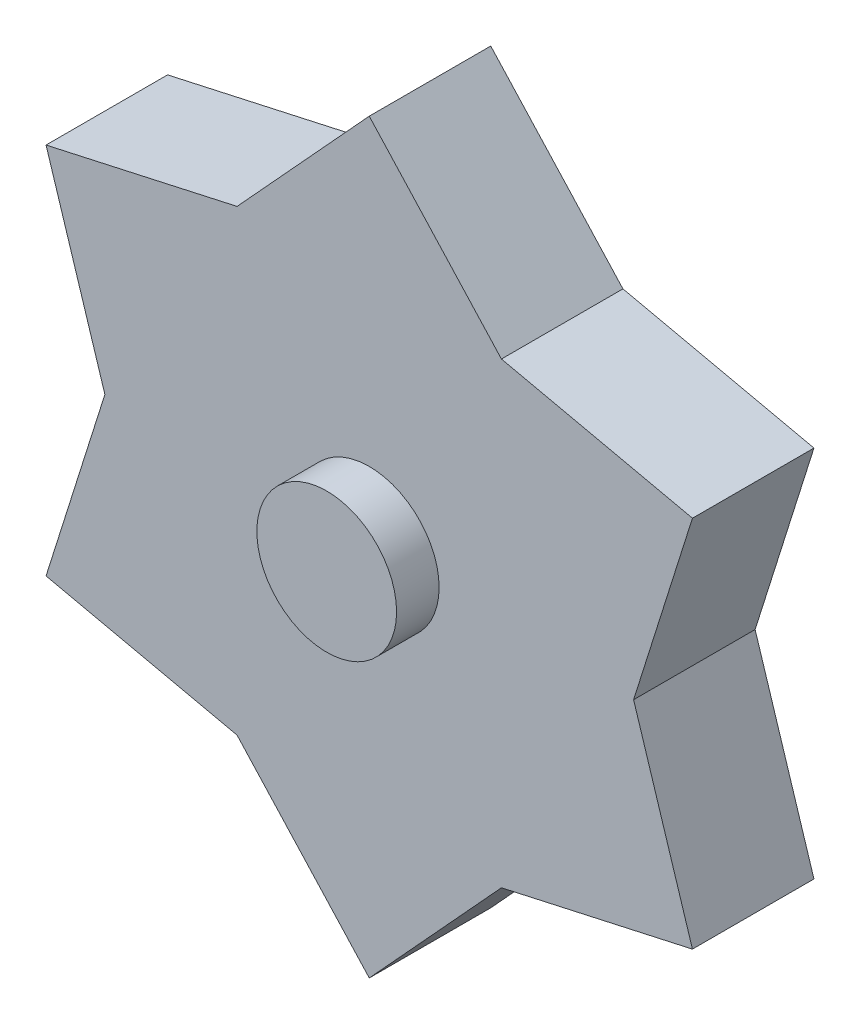
ISO-10303-21;
HEADER;
FILE_DESCRIPTION(('STEP AP214'),'2;1');
FILE_NAME('part.step','',(''),(''),'','','');
FILE_SCHEMA(('AUTOMOTIVE_DESIGN { 1 0 10303 214 1 1 1 1 }'));
ENDSEC;
DATA;
#1=APPLICATION_CONTEXT('core data for automotive mechanical design processes');
#2=APPLICATION_PROTOCOL_DEFINITION('international standard','automotive_design',2000,#1);
#3=PRODUCT_CONTEXT('',#1,'mechanical');
#4=PRODUCT('Part','Part','',(#3));
#5=PRODUCT_RELATED_PRODUCT_CATEGORY('part','',(#4));
#6=PRODUCT_DEFINITION_FORMATION('','',#4);
#7=PRODUCT_DEFINITION_CONTEXT('part definition',#1,'design');
#8=PRODUCT_DEFINITION('design','',#6,#7);
#9=PRODUCT_DEFINITION_SHAPE('','',#8);
#10=(LENGTH_UNIT() NAMED_UNIT(*) SI_UNIT(.MILLI.,.METRE.));
#11=(NAMED_UNIT(*) PLANE_ANGLE_UNIT() SI_UNIT($,.RADIAN.));
#12=(NAMED_UNIT(*) SI_UNIT($,.STERADIAN.) SOLID_ANGLE_UNIT());
#13=UNCERTAINTY_MEASURE_WITH_UNIT(LENGTH_MEASURE(1.E-05),#10,'distance_accuracy_value','');
#14=(GEOMETRIC_REPRESENTATION_CONTEXT(3) GLOBAL_UNCERTAINTY_ASSIGNED_CONTEXT((#13)) GLOBAL_UNIT_ASSIGNED_CONTEXT((#10,
#11,#12)) REPRESENTATION_CONTEXT('',''));
#15=CARTESIAN_POINT('',(0.,0.,0.));
#16=DIRECTION('',(0.,0.,1.));
#17=DIRECTION('',(1.,0.,0.));
#18=AXIS2_PLACEMENT_3D('',#15,#16,#17);
#19=CARTESIAN_POINT('',(3.95792534560514,1.24792906794276,-2.));
#20=DIRECTION('',(-0.953716950748225,-0.300705799504278,0.));
#21=DIRECTION('',(0.300705799504278,-0.953716950748225,0.));
#22=AXIS2_PLACEMENT_3D('',#19,#20,#21);
#23=PLANE('',#22);
#24=DIRECTION('',(0.300705799504278,-0.953716950748225,0.));
#25=VECTOR('',#24,1.);
#26=CARTESIAN_POINT('',(3.95792534560514,1.24792906794276,0.));
#27=LINE('',#26,#25);
#28=CARTESIAN_POINT('',(4.35139586933438,0.,0.));
#29=VERTEX_POINT('',#28);
#30=CARTESIAN_POINT('',(5.31980094618253,-3.07138850831371,0.));
#31=VERTEX_POINT('',#30);
#32=EDGE_CURVE('E211',#29,#31,#27,.T.);
#33=ORIENTED_EDGE('',*,*,#32,.T.);
#34=DIRECTION('',(0.,0.,1.));
#35=VECTOR('',#34,1.);
#36=CARTESIAN_POINT('',(5.31980094618253,-3.07138850831371,-2.));
#37=LINE('',#36,#35);
#38=CARTESIAN_POINT('',(5.31980094618253,-3.07138850831371,-2.));
#39=VERTEX_POINT('',#38);
#40=EDGE_CURVE('E12',#39,#31,#37,.T.);
#41=ORIENTED_EDGE('',*,*,#40,.F.);
#42=DIRECTION('',(0.300705799504278,-0.953716950748225,0.));
#43=VECTOR('',#42,1.);
#44=CARTESIAN_POINT('',(3.95792534560514,1.24792906794276,-2.));
#45=LINE('',#44,#43);
#46=CARTESIAN_POINT('',(4.35139586933438,0.,-2.));
#47=VERTEX_POINT('',#46);
#48=EDGE_CURVE('E246',#47,#39,#45,.T.);
#49=ORIENTED_EDGE('',*,*,#48,.F.);
#50=DIRECTION('',(0.,0.,1.));
#51=VECTOR('',#50,1.);
#52=CARTESIAN_POINT('',(4.35139586933438,0.,-2.));
#53=LINE('',#52,#51);
#54=EDGE_CURVE('E89',#47,#29,#53,.T.);
#55=ORIENTED_EDGE('',*,*,#54,.T.);
#56=EDGE_LOOP('',(#33,#41,#49,#55));
#57=FACE_BOUND('',#56,.T.);
#58=ADVANCED_FACE('F86',(#57),#23,.F.);
#59=CARTESIAN_POINT('',(0.898224397843139,-4.05162842954775,-2.));
#60=DIRECTION('',(-0.216439613938104,0.976296007119933,0.));
#61=DIRECTION('',(-0.976296007119933,-0.216439613938104,0.));
#62=AXIS2_PLACEMENT_3D('',#59,#60,#61);
#63=PLANE('',#62);
#64=DIRECTION('',(-0.976296007119933,-0.216439613938104,0.));
#65=VECTOR('',#64,1.);
#66=CARTESIAN_POINT('',(0.898224397843139,-4.05162842954775,0.));
#67=LINE('',#66,#65);
#68=CARTESIAN_POINT('',(2.17569793466716,-3.76841936476627,0.));
#69=VERTEX_POINT('',#68);
#70=EDGE_CURVE('E142',#31,#69,#67,.T.);
#71=ORIENTED_EDGE('',*,*,#70,.T.);
#72=DIRECTION('',(0.,0.,1.));
#73=VECTOR('',#72,1.);
#74=CARTESIAN_POINT('',(2.17569793466716,-3.76841936476627,-2.));
#75=LINE('',#74,#73);
#76=CARTESIAN_POINT('',(2.17569793466716,-3.76841936476627,-2.));
#77=VERTEX_POINT('',#76);
#78=EDGE_CURVE('E96',#77,#69,#75,.T.);
#79=ORIENTED_EDGE('',*,*,#78,.F.);
#80=DIRECTION('',(-0.976296007119933,-0.216439613938104,0.));
#81=VECTOR('',#80,1.);
#82=CARTESIAN_POINT('',(0.898224397843139,-4.05162842954775,-2.));
#83=LINE('',#82,#81);
#84=EDGE_CURVE('E104',#39,#77,#83,.T.);
#85=ORIENTED_EDGE('',*,*,#84,.F.);
#86=ORIENTED_EDGE('',*,*,#40,.T.);
#87=EDGE_LOOP('',(#71,#79,#85,#86));
#88=FACE_BOUND('',#87,.T.);
#89=ADVANCED_FACE('F301',(#88),#63,.F.);
#90=CARTESIAN_POINT('',(3.05970094776203,-2.80369936160497,-2.));
#91=DIRECTION('',(-0.737277336810128,0.675590207615656,0.));
#92=DIRECTION('',(-0.675590207615656,-0.737277336810128,0.));
#93=AXIS2_PLACEMENT_3D('',#90,#91,#92);
#94=PLANE('',#93);
#95=DIRECTION('',(-0.675590207615656,-0.737277336810128,0.));
#96=VECTOR('',#95,1.);
#97=CARTESIAN_POINT('',(3.05970094776203,-2.80369936160497,0.));
#98=LINE('',#97,#96);
#99=CARTESIAN_POINT('',(0.,-6.14277701662742,0.));
#100=VERTEX_POINT('',#99);
#101=EDGE_CURVE('E192',#69,#100,#98,.T.);
#102=ORIENTED_EDGE('',*,*,#101,.T.);
#103=DIRECTION('',(0.,0.,1.));
#104=VECTOR('',#103,1.);
#105=CARTESIAN_POINT('',(0.,-6.14277701662742,-2.));
#106=LINE('',#105,#104);
#107=CARTESIAN_POINT('',(0.,-6.14277701662742,-2.));
#108=VERTEX_POINT('',#107);
#109=EDGE_CURVE('E190',#108,#100,#106,.T.);
#110=ORIENTED_EDGE('',*,*,#109,.F.);
#111=DIRECTION('',(-0.675590207615656,-0.737277336810128,0.));
#112=VECTOR('',#111,1.);
#113=CARTESIAN_POINT('',(3.05970094776203,-2.80369936160497,-2.));
#114=LINE('',#113,#112);
#115=EDGE_CURVE('E180',#77,#108,#114,.T.);
#116=ORIENTED_EDGE('',*,*,#115,.F.);
#117=ORIENTED_EDGE('',*,*,#78,.T.);
#118=EDGE_LOOP('',(#102,#110,#116,#117));
#119=FACE_BOUND('',#118,.T.);
#120=ADVANCED_FACE('F191',(#119),#94,.F.);
#121=CARTESIAN_POINT('',(-3.05970094776203,-2.80369936160502,-2.));
#122=DIRECTION('',(0.737277336810123,0.675590207615661,0.));
#123=DIRECTION('',(-0.675590207615661,0.737277336810123,0.));
#124=AXIS2_PLACEMENT_3D('',#121,#122,#123);
#125=PLANE('',#124);
#126=DIRECTION('',(-0.675590207615661,0.737277336810123,0.));
#127=VECTOR('',#126,1.);
#128=CARTESIAN_POINT('',(-3.05970094776203,-2.80369936160502,0.));
#129=LINE('',#128,#127);
#130=CARTESIAN_POINT('',(-2.17569793466723,-3.76841936476623,0.));
#131=VERTEX_POINT('',#130);
#132=EDGE_CURVE('E240',#100,#131,#129,.T.);
#133=ORIENTED_EDGE('',*,*,#132,.T.);
#134=DIRECTION('',(0.,0.,1.));
#135=VECTOR('',#134,1.);
#136=CARTESIAN_POINT('',(-2.17569793466723,-3.76841936476623,-2.));
#137=LINE('',#136,#135);
#138=CARTESIAN_POINT('',(-2.17569793466723,-3.76841936476623,-2.));
#139=VERTEX_POINT('',#138);
#140=EDGE_CURVE('E196',#139,#131,#137,.T.);
#141=ORIENTED_EDGE('',*,*,#140,.F.);
#142=DIRECTION('',(-0.675590207615661,0.737277336810123,0.));
#143=VECTOR('',#142,1.);
#144=CARTESIAN_POINT('',(-3.05970094776203,-2.80369936160502,-2.));
#145=LINE('',#144,#143);
#146=EDGE_CURVE('E184',#108,#139,#145,.T.);
#147=ORIENTED_EDGE('',*,*,#146,.F.);
#148=ORIENTED_EDGE('',*,*,#109,.T.);
#149=EDGE_LOOP('',(#133,#141,#147,#148));
#150=FACE_BOUND('',#149,.T.);
#151=ADVANCED_FACE('F198',(#150),#125,.F.);
#152=CARTESIAN_POINT('',(-0.898224397843104,-4.05162842954773,-2.));
#153=DIRECTION('',(0.216439613938097,0.976296007119935,0.));
#154=DIRECTION('',(-0.976296007119935,0.216439613938097,0.));
#155=AXIS2_PLACEMENT_3D('',#152,#153,#154);
#156=PLANE('',#155);
#157=DIRECTION('',(-0.976296007119935,0.216439613938097,0.));
#158=VECTOR('',#157,1.);
#159=CARTESIAN_POINT('',(-0.898224397843104,-4.05162842954773,0.));
#160=LINE('',#159,#158);
#161=CARTESIAN_POINT('',(-5.31980094618253,-3.07138850831371,0.));
#162=VERTEX_POINT('',#161);
#163=EDGE_CURVE('E237',#131,#162,#160,.T.);
#164=ORIENTED_EDGE('',*,*,#163,.T.);
#165=DIRECTION('',(0.,0.,1.));
#166=VECTOR('',#165,1.);
#167=CARTESIAN_POINT('',(-5.31980094618253,-3.07138850831371,-2.));
#168=LINE('',#167,#166);
#169=CARTESIAN_POINT('',(-5.31980094618253,-3.07138850831371,-2.));
#170=VERTEX_POINT('',#169);
#171=EDGE_CURVE('E252',#170,#162,#168,.T.);
#172=ORIENTED_EDGE('',*,*,#171,.F.);
#173=DIRECTION('',(-0.976296007119935,0.216439613938097,0.));
#174=VECTOR('',#173,1.);
#175=CARTESIAN_POINT('',(-0.898224397843104,-4.05162842954773,-2.));
#176=LINE('',#175,#174);
#177=EDGE_CURVE('E202',#139,#170,#176,.T.);
#178=ORIENTED_EDGE('',*,*,#177,.F.);
#179=ORIENTED_EDGE('',*,*,#140,.T.);
#180=EDGE_LOOP('',(#164,#172,#178,#179));
#181=FACE_BOUND('',#180,.T.);
#182=ADVANCED_FACE('F314',(#181),#156,.F.);
#183=CARTESIAN_POINT('',(-3.95792534560517,1.24792906794274,-2.));
#184=DIRECTION('',(0.953716950748227,-0.300705799504272,0.));
#185=DIRECTION('',(0.300705799504272,0.953716950748228,0.));
#186=AXIS2_PLACEMENT_3D('',#183,#184,#185);
#187=PLANE('',#186);
#188=DIRECTION('',(0.300705799504272,0.953716950748228,0.));
#189=VECTOR('',#188,1.);
#190=CARTESIAN_POINT('',(-3.95792534560517,1.24792906794274,0.));
#191=LINE('',#190,#189);
#192=CARTESIAN_POINT('',(-4.35139586933439,0.,0.));
#193=VERTEX_POINT('',#192);
#194=EDGE_CURVE('E234',#162,#193,#191,.T.);
#195=ORIENTED_EDGE('',*,*,#194,.T.);
#196=DIRECTION('',(0.,0.,1.));
#197=VECTOR('',#196,1.);
#198=CARTESIAN_POINT('',(-4.35139586933439,0.,-2.));
#199=LINE('',#198,#197);
#200=CARTESIAN_POINT('',(-4.35139586933439,0.,-2.));
#201=VERTEX_POINT('',#200);
#202=EDGE_CURVE('E256',#201,#193,#199,.T.);
#203=ORIENTED_EDGE('',*,*,#202,.F.);
#204=DIRECTION('',(0.300705799504272,0.953716950748228,0.));
#205=VECTOR('',#204,1.);
#206=CARTESIAN_POINT('',(-3.95792534560517,1.24792906794274,-2.));
#207=LINE('',#206,#205);
#208=EDGE_CURVE('E205',#170,#201,#207,.T.);
#209=ORIENTED_EDGE('',*,*,#208,.F.);
#210=ORIENTED_EDGE('',*,*,#171,.T.);
#211=EDGE_LOOP('',(#195,#203,#209,#210));
#212=FACE_BOUND('',#211,.T.);
#213=ADVANCED_FACE('F317',(#212),#187,.F.);
#214=CARTESIAN_POINT('',(-3.95792534560514,-1.24792906794276,-2.));
#215=DIRECTION('',(0.953716950748225,0.300705799504279,0.));
#216=DIRECTION('',(-0.300705799504279,0.953716950748225,0.));
#217=AXIS2_PLACEMENT_3D('',#214,#215,#216);
#218=PLANE('',#217);
#219=DIRECTION('',(-0.300705799504279,0.953716950748225,0.));
#220=VECTOR('',#219,1.);
#221=CARTESIAN_POINT('',(-3.95792534560514,-1.24792906794276,0.));
#222=LINE('',#221,#220);
#223=CARTESIAN_POINT('',(-5.31980094618253,3.07138850831371,0.));
#224=VERTEX_POINT('',#223);
#225=EDGE_CURVE('E231',#193,#224,#222,.T.);
#226=ORIENTED_EDGE('',*,*,#225,.T.);
#227=DIRECTION('',(0.,0.,1.));
#228=VECTOR('',#227,1.);
#229=CARTESIAN_POINT('',(-5.31980094618253,3.07138850831371,-2.));
#230=LINE('',#229,#228);
#231=CARTESIAN_POINT('',(-5.31980094618253,3.07138850831371,-2.));
#232=VERTEX_POINT('',#231);
#233=EDGE_CURVE('E260',#232,#224,#230,.T.);
#234=ORIENTED_EDGE('',*,*,#233,.F.);
#235=DIRECTION('',(-0.300705799504279,0.953716950748225,0.));
#236=VECTOR('',#235,1.);
#237=CARTESIAN_POINT('',(-3.95792534560514,-1.24792906794276,-2.));
#238=LINE('',#237,#236);
#239=EDGE_CURVE('E359',#201,#232,#238,.T.);
#240=ORIENTED_EDGE('',*,*,#239,.F.);
#241=ORIENTED_EDGE('',*,*,#202,.T.);
#242=EDGE_LOOP('',(#226,#234,#240,#241));
#243=FACE_BOUND('',#242,.T.);
#244=ADVANCED_FACE('F321',(#243),#218,.F.);
#245=CARTESIAN_POINT('',(-0.898224397843142,4.05162842954775,-2.));
#246=DIRECTION('',(0.216439613938105,-0.976296007119933,0.));
#247=DIRECTION('',(0.976296007119933,0.216439613938105,0.));
#248=AXIS2_PLACEMENT_3D('',#245,#246,#247);
#249=PLANE('',#248);
#250=DIRECTION('',(0.976296007119933,0.216439613938105,0.));
#251=VECTOR('',#250,1.);
#252=CARTESIAN_POINT('',(-0.898224397843142,4.05162842954775,0.));
#253=LINE('',#252,#251);
#254=CARTESIAN_POINT('',(-2.17569793466716,3.76841936476627,0.));
#255=VERTEX_POINT('',#254);
#256=EDGE_CURVE('E228',#224,#255,#253,.T.);
#257=ORIENTED_EDGE('',*,*,#256,.T.);
#258=DIRECTION('',(0.,0.,1.));
#259=VECTOR('',#258,1.);
#260=CARTESIAN_POINT('',(-2.17569793466716,3.76841936476627,-2.));
#261=LINE('',#260,#259);
#262=CARTESIAN_POINT('',(-2.17569793466716,3.76841936476627,-2.));
#263=VERTEX_POINT('',#262);
#264=EDGE_CURVE('E264',#263,#255,#261,.T.);
#265=ORIENTED_EDGE('',*,*,#264,.F.);
#266=DIRECTION('',(0.976296007119933,0.216439613938105,0.));
#267=VECTOR('',#266,1.);
#268=CARTESIAN_POINT('',(-0.898224397843142,4.05162842954775,-2.));
#269=LINE('',#268,#267);
#270=EDGE_CURVE('E356',#232,#263,#269,.T.);
#271=ORIENTED_EDGE('',*,*,#270,.F.);
#272=ORIENTED_EDGE('',*,*,#233,.T.);
#273=EDGE_LOOP('',(#257,#265,#271,#272));
#274=FACE_BOUND('',#273,.T.);
#275=ADVANCED_FACE('F325',(#274),#249,.F.);
#276=CARTESIAN_POINT('',(-3.05970094776203,2.80369936160498,-2.));
#277=DIRECTION('',(0.737277336810128,-0.675590207615656,0.));
#278=DIRECTION('',(0.675590207615656,0.737277336810128,0.));
#279=AXIS2_PLACEMENT_3D('',#276,#277,#278);
#280=PLANE('',#279);
#281=DIRECTION('',(0.675590207615656,0.737277336810128,0.));
#282=VECTOR('',#281,1.);
#283=CARTESIAN_POINT('',(-3.05970094776203,2.80369936160498,0.));
#284=LINE('',#283,#282);
#285=CARTESIAN_POINT('',(0.,6.14277701662742,0.));
#286=VERTEX_POINT('',#285);
#287=EDGE_CURVE('E225',#255,#286,#284,.T.);
#288=ORIENTED_EDGE('',*,*,#287,.T.);
#289=DIRECTION('',(0.,0.,1.));
#290=VECTOR('',#289,1.);
#291=CARTESIAN_POINT('',(0.,6.14277701662742,-2.));
#292=LINE('',#291,#290);
#293=CARTESIAN_POINT('',(0.,6.14277701662742,-2.));
#294=VERTEX_POINT('',#293);
#295=EDGE_CURVE('E268',#294,#286,#292,.T.);
#296=ORIENTED_EDGE('',*,*,#295,.F.);
#297=DIRECTION('',(0.675590207615656,0.737277336810128,0.));
#298=VECTOR('',#297,1.);
#299=CARTESIAN_POINT('',(-3.05970094776203,2.80369936160498,-2.));
#300=LINE('',#299,#298);
#301=EDGE_CURVE('E349',#263,#294,#300,.T.);
#302=ORIENTED_EDGE('',*,*,#301,.F.);
#303=ORIENTED_EDGE('',*,*,#264,.T.);
#304=EDGE_LOOP('',(#288,#296,#302,#303));
#305=FACE_BOUND('',#304,.T.);
#306=ADVANCED_FACE('F329',(#305),#280,.F.);
#307=CARTESIAN_POINT('',(3.05970094776203,2.80369936160501,-2.));
#308=DIRECTION('',(-0.737277336810123,-0.675590207615661,0.));
#309=DIRECTION('',(0.675590207615661,-0.737277336810123,0.));
#310=AXIS2_PLACEMENT_3D('',#307,#308,#309);
#311=PLANE('',#310);
#312=DIRECTION('',(0.675590207615661,-0.737277336810123,0.));
#313=VECTOR('',#312,1.);
#314=CARTESIAN_POINT('',(3.05970094776203,2.80369936160501,0.));
#315=LINE('',#314,#313);
#316=CARTESIAN_POINT('',(2.17569793466722,3.76841936476623,0.));
#317=VERTEX_POINT('',#316);
#318=EDGE_CURVE('E222',#286,#317,#315,.T.);
#319=ORIENTED_EDGE('',*,*,#318,.T.);
#320=DIRECTION('',(0.,0.,1.));
#321=VECTOR('',#320,1.);
#322=CARTESIAN_POINT('',(2.17569793466722,3.76841936476623,-2.));
#323=LINE('',#322,#321);
#324=CARTESIAN_POINT('',(2.17569793466722,3.76841936476623,-2.));
#325=VERTEX_POINT('',#324);
#326=EDGE_CURVE('E272',#325,#317,#323,.T.);
#327=ORIENTED_EDGE('',*,*,#326,.F.);
#328=DIRECTION('',(0.675590207615661,-0.737277336810123,0.));
#329=VECTOR('',#328,1.);
#330=CARTESIAN_POINT('',(3.05970094776203,2.80369936160501,-2.));
#331=LINE('',#330,#329);
#332=EDGE_CURVE('E345',#294,#325,#331,.T.);
#333=ORIENTED_EDGE('',*,*,#332,.F.);
#334=ORIENTED_EDGE('',*,*,#295,.T.);
#335=EDGE_LOOP('',(#319,#327,#333,#334));
#336=FACE_BOUND('',#335,.T.);
#337=ADVANCED_FACE('F297',(#336),#311,.F.);
#338=CARTESIAN_POINT('',(0.898224397843106,4.05162842954773,-2.));
#339=DIRECTION('',(-0.216439613938098,-0.976296007119935,0.));
#340=DIRECTION('',(0.976296007119935,-0.216439613938098,0.));
#341=AXIS2_PLACEMENT_3D('',#338,#339,#340);
#342=PLANE('',#341);
#343=DIRECTION('',(0.976296007119935,-0.216439613938098,0.));
#344=VECTOR('',#343,1.);
#345=CARTESIAN_POINT('',(0.898224397843106,4.05162842954773,0.));
#346=LINE('',#345,#344);
#347=CARTESIAN_POINT('',(5.31980094618253,3.07138850831371,0.));
#348=VERTEX_POINT('',#347);
#349=EDGE_CURVE('E219',#317,#348,#346,.T.);
#350=ORIENTED_EDGE('',*,*,#349,.T.);
#351=DIRECTION('',(0.,0.,1.));
#352=VECTOR('',#351,1.);
#353=CARTESIAN_POINT('',(5.31980094618253,3.07138850831371,-2.));
#354=LINE('',#353,#352);
#355=CARTESIAN_POINT('',(5.31980094618253,3.07138850831371,-2.));
#356=VERTEX_POINT('',#355);
#357=EDGE_CURVE('E275',#356,#348,#354,.T.);
#358=ORIENTED_EDGE('',*,*,#357,.F.);
#359=DIRECTION('',(0.976296007119935,-0.216439613938098,0.));
#360=VECTOR('',#359,1.);
#361=CARTESIAN_POINT('',(0.898224397843106,4.05162842954773,-2.));
#362=LINE('',#361,#360);
#363=EDGE_CURVE('E343',#325,#356,#362,.T.);
#364=ORIENTED_EDGE('',*,*,#363,.F.);
#365=ORIENTED_EDGE('',*,*,#326,.T.);
#366=EDGE_LOOP('',(#350,#358,#364,#365));
#367=FACE_BOUND('',#366,.T.);
#368=ADVANCED_FACE('F291',(#367),#342,.F.);
#369=CARTESIAN_POINT('',(3.95792534560517,-1.24792906794274,-2.));
#370=DIRECTION('',(-0.953716950748227,0.300705799504272,0.));
#371=DIRECTION('',(-0.300705799504272,-0.953716950748227,0.));
#372=AXIS2_PLACEMENT_3D('',#369,#370,#371);
#373=PLANE('',#372);
#374=DIRECTION('',(-0.300705799504272,-0.953716950748227,0.));
#375=VECTOR('',#374,1.);
#376=CARTESIAN_POINT('',(3.95792534560517,-1.24792906794274,0.));
#377=LINE('',#376,#375);
#378=EDGE_CURVE('E215',#348,#29,#377,.T.);
#379=ORIENTED_EDGE('',*,*,#378,.T.);
#380=ORIENTED_EDGE('',*,*,#54,.F.);
#381=DIRECTION('',(-0.300705799504272,-0.953716950748227,0.));
#382=VECTOR('',#381,1.);
#383=CARTESIAN_POINT('',(3.95792534560517,-1.24792906794274,-2.));
#384=LINE('',#383,#382);
#385=EDGE_CURVE('E154',#356,#47,#384,.T.);
#386=ORIENTED_EDGE('',*,*,#385,.F.);
#387=ORIENTED_EDGE('',*,*,#357,.T.);
#388=EDGE_LOOP('',(#379,#380,#386,#387));
#389=FACE_BOUND('',#388,.T.);
#390=ADVANCED_FACE('F289',(#389),#373,.F.);
#391=CARTESIAN_POINT('',(0.,0.,-2.));
#392=DIRECTION('',(0.,0.,1.));
#393=DIRECTION('',(1.,0.,0.));
#394=AXIS2_PLACEMENT_3D('',#391,#392,#393);
#395=PLANE('',#394);
#396=ORIENTED_EDGE('',*,*,#48,.T.);
#397=ORIENTED_EDGE('',*,*,#84,.T.);
#398=ORIENTED_EDGE('',*,*,#115,.T.);
#399=ORIENTED_EDGE('',*,*,#146,.T.);
#400=ORIENTED_EDGE('',*,*,#177,.T.);
#401=ORIENTED_EDGE('',*,*,#208,.T.);
#402=ORIENTED_EDGE('',*,*,#239,.T.);
#403=ORIENTED_EDGE('',*,*,#270,.T.);
#404=ORIENTED_EDGE('',*,*,#301,.T.);
#405=ORIENTED_EDGE('',*,*,#332,.T.);
#406=ORIENTED_EDGE('',*,*,#363,.T.);
#407=ORIENTED_EDGE('',*,*,#385,.T.);
#408=EDGE_LOOP('',(#396,#397,#398,#399,#400,#401,#402,#403,#404,#405,#406,#407));
#409=FACE_BOUND('',#408,.T.);
#410=ADVANCED_FACE('F182',(#409),#395,.F.);
#411=CARTESIAN_POINT('',(0.,0.,0.));
#412=DIRECTION('',(0.,0.,1.));
#413=DIRECTION('',(1.,0.,0.));
#414=AXIS2_PLACEMENT_3D('',#411,#412,#413);
#415=PLANE('',#414);
#416=CARTESIAN_POINT('',(0.,0.,0.));
#417=DIRECTION('',(0.,0.,1.));
#418=DIRECTION('',(1.,0.,0.));
#419=AXIS2_PLACEMENT_3D('',#416,#417,#418);
#420=CIRCLE('',#419,1.15);
#421=CARTESIAN_POINT('',(1.15,0.,0.));
#422=VERTEX_POINT('',#421);
#423=EDGE_CURVE('E376',#422,#422,#420,.T.);
#424=ORIENTED_EDGE('',*,*,#423,.F.);
#425=EDGE_LOOP('',(#424));
#426=FACE_BOUND('',#425,.T.);
#427=ORIENTED_EDGE('',*,*,#32,.F.);
#428=ORIENTED_EDGE('',*,*,#378,.F.);
#429=ORIENTED_EDGE('',*,*,#349,.F.);
#430=ORIENTED_EDGE('',*,*,#318,.F.);
#431=ORIENTED_EDGE('',*,*,#287,.F.);
#432=ORIENTED_EDGE('',*,*,#256,.F.);
#433=ORIENTED_EDGE('',*,*,#225,.F.);
#434=ORIENTED_EDGE('',*,*,#194,.F.);
#435=ORIENTED_EDGE('',*,*,#163,.F.);
#436=ORIENTED_EDGE('',*,*,#132,.F.);
#437=ORIENTED_EDGE('',*,*,#101,.F.);
#438=ORIENTED_EDGE('',*,*,#70,.F.);
#439=EDGE_LOOP('',(#427,#428,#429,#430,#431,#432,#433,#434,#435,#436,#437,#438));
#440=FACE_BOUND('',#439,.T.);
#441=ADVANCED_FACE('F286',(#426,#440),#415,.T.);
#442=CARTESIAN_POINT('',(0.,0.,0.7));
#443=DIRECTION('',(0.,0.,-1.));
#444=DIRECTION('',(-1.,0.,0.));
#445=AXIS2_PLACEMENT_3D('',#442,#443,#444);
#446=CYLINDRICAL_SURFACE('',#445,1.15);
#447=CARTESIAN_POINT('',(0.,0.,0.7));
#448=DIRECTION('',(0.,0.,1.));
#449=DIRECTION('',(1.,0.,0.));
#450=AXIS2_PLACEMENT_3D('',#447,#448,#449);
#451=CIRCLE('',#450,1.15);
#452=CARTESIAN_POINT('',(1.15,0.,0.7));
#453=VERTEX_POINT('',#452);
#454=EDGE_CURVE('E216',#453,#453,#451,.T.);
#455=ORIENTED_EDGE('',*,*,#454,.F.);
#456=EDGE_LOOP('',(#455));
#457=FACE_BOUND('',#456,.T.);
#458=ORIENTED_EDGE('',*,*,#423,.T.);
#459=EDGE_LOOP('',(#458));
#460=FACE_BOUND('',#459,.T.);
#461=ADVANCED_FACE('F386',(#457,#460),#446,.T.);
#462=CARTESIAN_POINT('',(0.,0.,0.7));
#463=DIRECTION('',(0.,0.,1.));
#464=DIRECTION('',(1.,0.,0.));
#465=AXIS2_PLACEMENT_3D('',#462,#463,#464);
#466=PLANE('',#465);
#467=ORIENTED_EDGE('',*,*,#454,.T.);
#468=EDGE_LOOP('',(#467));
#469=FACE_BOUND('',#468,.T.);
#470=ADVANCED_FACE('F384',(#469),#466,.T.);
#471=CLOSED_SHELL('',(#58,#89,#120,#151,#182,#213,#244,#275,#306,#337,#368,#390,#410,#441,#461,#470));
#472=MANIFOLD_SOLID_BREP('B2',#471);
#473=ADVANCED_BREP_SHAPE_REPRESENTATION('',(#18,#472),#14);
#474=SHAPE_DEFINITION_REPRESENTATION(#9,#473);
ENDSEC;
END-ISO-10303-21;
